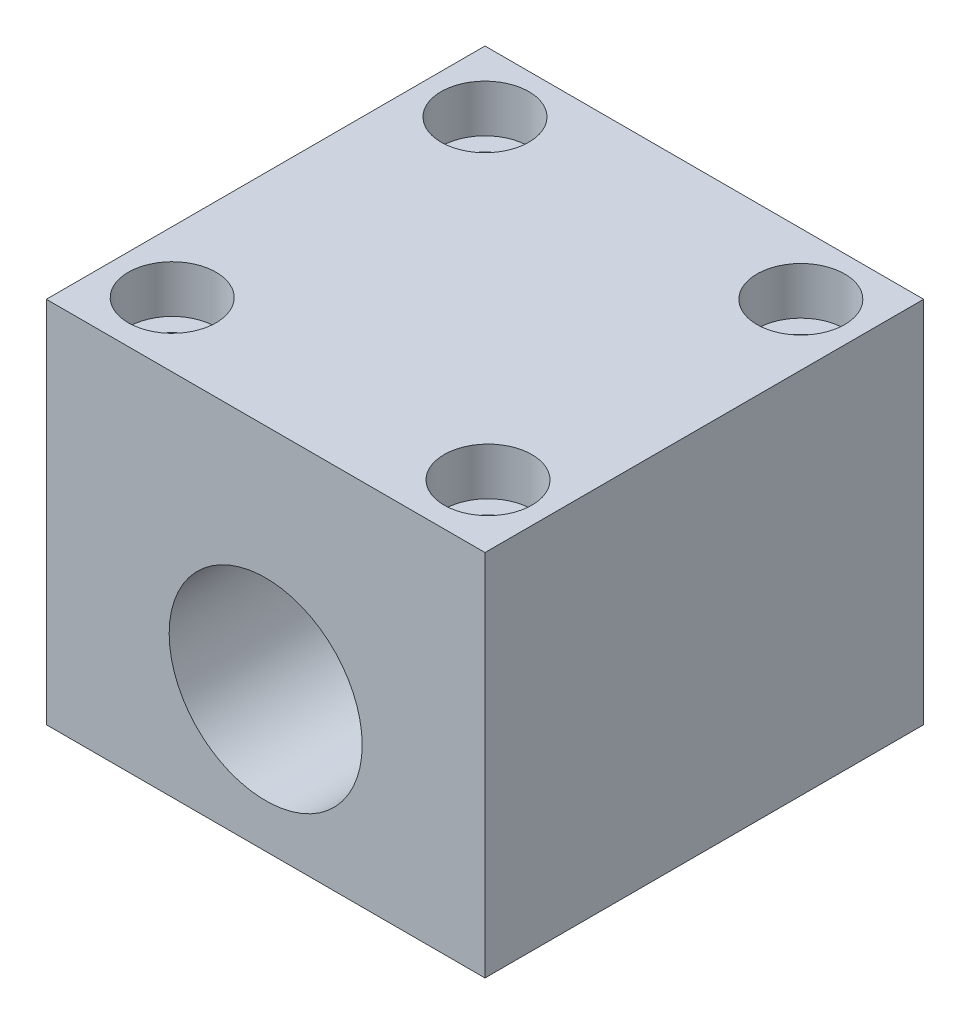
ISO-10303-21;
HEADER;
FILE_DESCRIPTION(('STEP AP214'),'2;1');
FILE_NAME('part.step','',(''),(''),'','','');
FILE_SCHEMA(('AUTOMOTIVE_DESIGN { 1 0 10303 214 1 1 1 1 }'));
ENDSEC;
DATA;
#1=APPLICATION_CONTEXT('core data for automotive mechanical design processes');
#2=APPLICATION_PROTOCOL_DEFINITION('international standard','automotive_design',2000,#1);
#3=PRODUCT_CONTEXT('',#1,'mechanical');
#4=PRODUCT('Part','Part','',(#3));
#5=PRODUCT_RELATED_PRODUCT_CATEGORY('part','',(#4));
#6=PRODUCT_DEFINITION_FORMATION('','',#4);
#7=PRODUCT_DEFINITION_CONTEXT('part definition',#1,'design');
#8=PRODUCT_DEFINITION('design','',#6,#7);
#9=PRODUCT_DEFINITION_SHAPE('','',#8);
#10=(LENGTH_UNIT() NAMED_UNIT(*) SI_UNIT(.MILLI.,.METRE.));
#11=(NAMED_UNIT(*) PLANE_ANGLE_UNIT() SI_UNIT($,.RADIAN.));
#12=(NAMED_UNIT(*) SI_UNIT($,.STERADIAN.) SOLID_ANGLE_UNIT());
#13=UNCERTAINTY_MEASURE_WITH_UNIT(LENGTH_MEASURE(1.E-05),#10,'distance_accuracy_value','');
#14=(GEOMETRIC_REPRESENTATION_CONTEXT(3) GLOBAL_UNCERTAINTY_ASSIGNED_CONTEXT((#13)) GLOBAL_UNIT_ASSIGNED_CONTEXT((#10,
#11,#12)) REPRESENTATION_CONTEXT('',''));
#15=CARTESIAN_POINT('',(0.,0.,0.));
#16=DIRECTION('',(0.,0.,1.));
#17=DIRECTION('',(1.,0.,0.));
#18=AXIS2_PLACEMENT_3D('',#15,#16,#17);
#19=CARTESIAN_POINT('',(-25.,-21.,-50.));
#20=DIRECTION('',(-1.,0.,0.));
#21=DIRECTION('',(0.,-1.,0.));
#22=AXIS2_PLACEMENT_3D('',#19,#20,#21);
#23=PLANE('',#22);
#24=DIRECTION('',(0.,-1.,0.));
#25=VECTOR('',#24,1.);
#26=CARTESIAN_POINT('',(-25.,-21.,0.));
#27=LINE('',#26,#25);
#28=CARTESIAN_POINT('',(-25.,21.,0.));
#29=VERTEX_POINT('',#28);
#30=CARTESIAN_POINT('',(-25.,-21.,0.));
#31=VERTEX_POINT('',#30);
#32=EDGE_CURVE('E103',#29,#31,#27,.T.);
#33=ORIENTED_EDGE('',*,*,#32,.F.);
#34=DIRECTION('',(0.,0.,1.));
#35=VECTOR('',#34,1.);
#36=CARTESIAN_POINT('',(-25.,21.,-50.));
#37=LINE('',#36,#35);
#38=CARTESIAN_POINT('',(-25.,21.,-50.));
#39=VERTEX_POINT('',#38);
#40=EDGE_CURVE('E11',#39,#29,#37,.T.);
#41=ORIENTED_EDGE('',*,*,#40,.F.);
#42=DIRECTION('',(0.,-1.,0.));
#43=VECTOR('',#42,1.);
#44=CARTESIAN_POINT('',(-25.,-21.,-50.));
#45=LINE('',#44,#43);
#46=CARTESIAN_POINT('',(-25.,-21.,-50.));
#47=VERTEX_POINT('',#46);
#48=EDGE_CURVE('E97',#39,#47,#45,.T.);
#49=ORIENTED_EDGE('',*,*,#48,.T.);
#50=DIRECTION('',(0.,0.,1.));
#51=VECTOR('',#50,1.);
#52=CARTESIAN_POINT('',(-25.,-21.,-50.));
#53=LINE('',#52,#51);
#54=EDGE_CURVE('E76',#47,#31,#53,.T.);
#55=ORIENTED_EDGE('',*,*,#54,.T.);
#56=EDGE_LOOP('',(#33,#41,#49,#55));
#57=FACE_BOUND('',#56,.T.);
#58=ADVANCED_FACE('F36',(#57),#23,.T.);
#59=CARTESIAN_POINT('',(-25.,21.,-50.));
#60=DIRECTION('',(0.,1.,0.));
#61=DIRECTION('',(0.,0.,1.));
#62=AXIS2_PLACEMENT_3D('',#59,#60,#61);
#63=PLANE('',#62);
#64=CARTESIAN_POINT('',(-18.,21.,-43.));
#65=DIRECTION('',(0.,1.,0.));
#66=DIRECTION('',(0.,0.,1.));
#67=AXIS2_PLACEMENT_3D('',#64,#65,#66);
#68=CIRCLE('',#67,5.);
#69=CARTESIAN_POINT('',(-18.,21.,-38.));
#70=VERTEX_POINT('',#69);
#71=EDGE_CURVE('E257',#70,#70,#68,.T.);
#72=ORIENTED_EDGE('',*,*,#71,.F.);
#73=EDGE_LOOP('',(#72));
#74=FACE_BOUND('',#73,.T.);
#75=CARTESIAN_POINT('',(-18.,21.,-7.34484149662151));
#76=DIRECTION('',(0.,1.,0.));
#77=DIRECTION('',(0.,0.,1.));
#78=AXIS2_PLACEMENT_3D('',#75,#76,#77);
#79=CIRCLE('',#78,5.);
#80=CARTESIAN_POINT('',(-18.,21.,-2.34484149662151));
#81=VERTEX_POINT('',#80);
#82=EDGE_CURVE('E265',#81,#81,#79,.T.);
#83=ORIENTED_EDGE('',*,*,#82,.F.);
#84=EDGE_LOOP('',(#83));
#85=FACE_BOUND('',#84,.T.);
#86=CARTESIAN_POINT('',(18.,21.,-7.34484149662151));
#87=DIRECTION('',(0.,1.,0.));
#88=DIRECTION('',(0.,0.,1.));
#89=AXIS2_PLACEMENT_3D('',#86,#87,#88);
#90=CIRCLE('',#89,5.);
#91=CARTESIAN_POINT('',(18.,21.,-2.34484149662151));
#92=VERTEX_POINT('',#91);
#93=EDGE_CURVE('E275',#92,#92,#90,.T.);
#94=ORIENTED_EDGE('',*,*,#93,.F.);
#95=EDGE_LOOP('',(#94));
#96=FACE_BOUND('',#95,.T.);
#97=CARTESIAN_POINT('',(18.,21.,-43.));
#98=DIRECTION('',(0.,1.,0.));
#99=DIRECTION('',(0.,0.,1.));
#100=AXIS2_PLACEMENT_3D('',#97,#98,#99);
#101=CIRCLE('',#100,5.);
#102=CARTESIAN_POINT('',(18.,21.,-38.));
#103=VERTEX_POINT('',#102);
#104=EDGE_CURVE('E285',#103,#103,#101,.T.);
#105=ORIENTED_EDGE('',*,*,#104,.F.);
#106=EDGE_LOOP('',(#105));
#107=FACE_BOUND('',#106,.T.);
#108=DIRECTION('',(-1.,0.,0.));
#109=VECTOR('',#108,1.);
#110=CARTESIAN_POINT('',(-25.,21.,0.));
#111=LINE('',#110,#109);
#112=CARTESIAN_POINT('',(25.,21.,0.));
#113=VERTEX_POINT('',#112);
#114=EDGE_CURVE('E67',#113,#29,#111,.T.);
#115=ORIENTED_EDGE('',*,*,#114,.F.);
#116=DIRECTION('',(0.,0.,1.));
#117=VECTOR('',#116,1.);
#118=CARTESIAN_POINT('',(25.,21.,-50.));
#119=LINE('',#118,#117);
#120=CARTESIAN_POINT('',(25.,21.,-50.));
#121=VERTEX_POINT('',#120);
#122=EDGE_CURVE('E45',#121,#113,#119,.T.);
#123=ORIENTED_EDGE('',*,*,#122,.F.);
#124=DIRECTION('',(-1.,0.,0.));
#125=VECTOR('',#124,1.);
#126=CARTESIAN_POINT('',(0.,21.,-50.));
#127=LINE('',#126,#125);
#128=EDGE_CURVE('E53',#121,#39,#127,.T.);
#129=ORIENTED_EDGE('',*,*,#128,.T.);
#130=ORIENTED_EDGE('',*,*,#40,.T.);
#131=EDGE_LOOP('',(#115,#123,#129,#130));
#132=FACE_BOUND('',#131,.T.);
#133=ADVANCED_FACE('F130',(#74,#85,#96,#107,#132),#63,.T.);
#134=CARTESIAN_POINT('',(25.,21.,-50.));
#135=DIRECTION('',(1.,0.,0.));
#136=DIRECTION('',(0.,1.,0.));
#137=AXIS2_PLACEMENT_3D('',#134,#135,#136);
#138=PLANE('',#137);
#139=DIRECTION('',(0.,1.,0.));
#140=VECTOR('',#139,1.);
#141=CARTESIAN_POINT('',(25.,21.,0.));
#142=LINE('',#141,#140);
#143=CARTESIAN_POINT('',(25.,-21.,0.));
#144=VERTEX_POINT('',#143);
#145=EDGE_CURVE('E87',#144,#113,#142,.T.);
#146=ORIENTED_EDGE('',*,*,#145,.F.);
#147=DIRECTION('',(0.,0.,1.));
#148=VECTOR('',#147,1.);
#149=CARTESIAN_POINT('',(25.,-21.,-50.));
#150=LINE('',#149,#148);
#151=CARTESIAN_POINT('',(25.,-21.,-50.));
#152=VERTEX_POINT('',#151);
#153=EDGE_CURVE('E82',#152,#144,#150,.T.);
#154=ORIENTED_EDGE('',*,*,#153,.F.);
#155=DIRECTION('',(0.,1.,0.));
#156=VECTOR('',#155,1.);
#157=CARTESIAN_POINT('',(25.,21.,-50.));
#158=LINE('',#157,#156);
#159=EDGE_CURVE('E85',#152,#121,#158,.T.);
#160=ORIENTED_EDGE('',*,*,#159,.T.);
#161=ORIENTED_EDGE('',*,*,#122,.T.);
#162=EDGE_LOOP('',(#146,#154,#160,#161));
#163=FACE_BOUND('',#162,.T.);
#164=ADVANCED_FACE('F84',(#163),#138,.T.);
#165=CARTESIAN_POINT('',(25.,-21.,-50.));
#166=DIRECTION('',(0.,-1.,0.));
#167=DIRECTION('',(1.,0.,0.));
#168=AXIS2_PLACEMENT_3D('',#165,#166,#167);
#169=PLANE('',#168);
#170=CARTESIAN_POINT('',(-18.,-21.,-43.));
#171=DIRECTION('',(0.,1.,0.));
#172=DIRECTION('',(0.,0.,1.));
#173=AXIS2_PLACEMENT_3D('',#170,#171,#172);
#174=CIRCLE('',#173,2.74999999999999);
#175=CARTESIAN_POINT('',(-18.,-21.,-40.25));
#176=VERTEX_POINT('',#175);
#177=EDGE_CURVE('E148',#176,#176,#174,.T.);
#178=ORIENTED_EDGE('',*,*,#177,.T.);
#179=EDGE_LOOP('',(#178));
#180=FACE_BOUND('',#179,.T.);
#181=CARTESIAN_POINT('',(-18.,-21.,-7.34484149662151));
#182=DIRECTION('',(0.,1.,0.));
#183=DIRECTION('',(0.,0.,1.));
#184=AXIS2_PLACEMENT_3D('',#181,#182,#183);
#185=CIRCLE('',#184,2.74999999999999);
#186=CARTESIAN_POINT('',(-18.,-21.,-4.59484149662152));
#187=VERTEX_POINT('',#186);
#188=EDGE_CURVE('E152',#187,#187,#185,.T.);
#189=ORIENTED_EDGE('',*,*,#188,.T.);
#190=EDGE_LOOP('',(#189));
#191=FACE_BOUND('',#190,.T.);
#192=CARTESIAN_POINT('',(18.,-21.,-7.34484149662151));
#193=DIRECTION('',(0.,1.,0.));
#194=DIRECTION('',(0.,0.,1.));
#195=AXIS2_PLACEMENT_3D('',#192,#193,#194);
#196=CIRCLE('',#195,2.74999999999999);
#197=CARTESIAN_POINT('',(18.,-21.,-4.59484149662152));
#198=VERTEX_POINT('',#197);
#199=EDGE_CURVE('E156',#198,#198,#196,.T.);
#200=ORIENTED_EDGE('',*,*,#199,.T.);
#201=EDGE_LOOP('',(#200));
#202=FACE_BOUND('',#201,.T.);
#203=CARTESIAN_POINT('',(18.,-21.,-43.));
#204=DIRECTION('',(0.,1.,0.));
#205=DIRECTION('',(0.,0.,1.));
#206=AXIS2_PLACEMENT_3D('',#203,#204,#205);
#207=CIRCLE('',#206,2.74999999999999);
#208=CARTESIAN_POINT('',(18.,-21.,-40.25));
#209=VERTEX_POINT('',#208);
#210=EDGE_CURVE('E159',#209,#209,#207,.T.);
#211=ORIENTED_EDGE('',*,*,#210,.T.);
#212=EDGE_LOOP('',(#211));
#213=FACE_BOUND('',#212,.T.);
#214=DIRECTION('',(1.,0.,0.));
#215=VECTOR('',#214,1.);
#216=CARTESIAN_POINT('',(25.,-21.,0.));
#217=LINE('',#216,#215);
#218=EDGE_CURVE('E106',#31,#144,#217,.T.);
#219=ORIENTED_EDGE('',*,*,#218,.F.);
#220=ORIENTED_EDGE('',*,*,#54,.F.);
#221=DIRECTION('',(1.,0.,0.));
#222=VECTOR('',#221,1.);
#223=CARTESIAN_POINT('',(25.,-21.,-50.));
#224=LINE('',#223,#222);
#225=EDGE_CURVE('E93',#47,#152,#224,.T.);
#226=ORIENTED_EDGE('',*,*,#225,.T.);
#227=ORIENTED_EDGE('',*,*,#153,.T.);
#228=EDGE_LOOP('',(#219,#220,#226,#227));
#229=FACE_BOUND('',#228,.T.);
#230=ADVANCED_FACE('F96',(#180,#191,#202,#213,#229),#169,.T.);
#231=CARTESIAN_POINT('',(0.,0.,-50.));
#232=DIRECTION('',(0.,0.,-1.));
#233=DIRECTION('',(-1.,0.,0.));
#234=AXIS2_PLACEMENT_3D('',#231,#232,#233);
#235=PLANE('',#234);
#236=CARTESIAN_POINT('',(0.,-5.,-50.));
#237=DIRECTION('',(0.,0.,-1.));
#238=DIRECTION('',(-1.,0.,0.));
#239=AXIS2_PLACEMENT_3D('',#236,#237,#238);
#240=CIRCLE('',#239,11.);
#241=CARTESIAN_POINT('',(-11.,-5.,-50.));
#242=VERTEX_POINT('',#241);
#243=EDGE_CURVE('E176',#242,#242,#240,.T.);
#244=ORIENTED_EDGE('',*,*,#243,.F.);
#245=EDGE_LOOP('',(#244));
#246=FACE_BOUND('',#245,.T.);
#247=ORIENTED_EDGE('',*,*,#48,.F.);
#248=ORIENTED_EDGE('',*,*,#128,.F.);
#249=ORIENTED_EDGE('',*,*,#159,.F.);
#250=ORIENTED_EDGE('',*,*,#225,.F.);
#251=EDGE_LOOP('',(#247,#248,#249,#250));
#252=FACE_BOUND('',#251,.T.);
#253=ADVANCED_FACE('F92',(#246,#252),#235,.T.);
#254=CARTESIAN_POINT('',(0.,0.,0.));
#255=DIRECTION('',(0.,0.,-1.));
#256=DIRECTION('',(-1.,0.,0.));
#257=AXIS2_PLACEMENT_3D('',#254,#255,#256);
#258=PLANE('',#257);
#259=CARTESIAN_POINT('',(0.,-5.,0.));
#260=DIRECTION('',(0.,0.,1.));
#261=DIRECTION('',(1.,0.,0.));
#262=AXIS2_PLACEMENT_3D('',#259,#260,#261);
#263=CIRCLE('',#262,11.);
#264=CARTESIAN_POINT('',(11.,-5.,0.));
#265=VERTEX_POINT('',#264);
#266=EDGE_CURVE('E172',#265,#265,#263,.T.);
#267=ORIENTED_EDGE('',*,*,#266,.F.);
#268=EDGE_LOOP('',(#267));
#269=FACE_BOUND('',#268,.T.);
#270=ORIENTED_EDGE('',*,*,#32,.T.);
#271=ORIENTED_EDGE('',*,*,#218,.T.);
#272=ORIENTED_EDGE('',*,*,#145,.T.);
#273=ORIENTED_EDGE('',*,*,#114,.T.);
#274=EDGE_LOOP('',(#270,#271,#272,#273));
#275=FACE_BOUND('',#274,.T.);
#276=ADVANCED_FACE('F113',(#269,#275),#258,.F.);
#277=CARTESIAN_POINT('',(0.,-5.,-36.));
#278=DIRECTION('',(0.,0.,-1.));
#279=DIRECTION('',(-1.,0.,0.));
#280=AXIS2_PLACEMENT_3D('',#277,#278,#279);
#281=CYLINDRICAL_SURFACE('',#280,11.);
#282=CARTESIAN_POINT('',(0.,-5.,-36.));
#283=DIRECTION('',(0.,0.,-1.));
#284=DIRECTION('',(-1.,0.,0.));
#285=AXIS2_PLACEMENT_3D('',#282,#283,#284);
#286=CIRCLE('',#285,11.);
#287=CARTESIAN_POINT('',(-11.,-5.,-36.));
#288=VERTEX_POINT('',#287);
#289=EDGE_CURVE('E107',#288,#288,#286,.T.);
#290=ORIENTED_EDGE('',*,*,#289,.F.);
#291=EDGE_LOOP('',(#290));
#292=FACE_BOUND('',#291,.T.);
#293=ORIENTED_EDGE('',*,*,#243,.T.);
#294=EDGE_LOOP('',(#293));
#295=FACE_BOUND('',#294,.T.);
#296=ADVANCED_FACE('F115',(#292,#295),#281,.F.);
#297=CARTESIAN_POINT('',(0.,-5.,-36.));
#298=DIRECTION('',(0.,0.,-1.));
#299=DIRECTION('',(-1.,0.,0.));
#300=AXIS2_PLACEMENT_3D('',#297,#298,#299);
#301=PLANE('',#300);
#302=CARTESIAN_POINT('',(0.,-5.,-36.));
#303=DIRECTION('',(0.,0.,-1.));
#304=DIRECTION('',(-1.,0.,0.));
#305=AXIS2_PLACEMENT_3D('',#302,#303,#304);
#306=CIRCLE('',#305,6.5);
#307=CARTESIAN_POINT('',(-6.5,-5.,-36.));
#308=VERTEX_POINT('',#307);
#309=EDGE_CURVE('E164',#308,#308,#306,.T.);
#310=ORIENTED_EDGE('',*,*,#309,.F.);
#311=EDGE_LOOP('',(#310));
#312=FACE_BOUND('',#311,.T.);
#313=ORIENTED_EDGE('',*,*,#289,.T.);
#314=EDGE_LOOP('',(#313));
#315=FACE_BOUND('',#314,.T.);
#316=ADVANCED_FACE('F122',(#312,#315),#301,.T.);
#317=CARTESIAN_POINT('',(0.,-5.,-30.));
#318=DIRECTION('',(0.,0.,1.));
#319=DIRECTION('',(1.,0.,0.));
#320=AXIS2_PLACEMENT_3D('',#317,#318,#319);
#321=CYLINDRICAL_SURFACE('',#320,11.);
#322=CARTESIAN_POINT('',(0.,-5.,-30.));
#323=DIRECTION('',(0.,0.,1.));
#324=DIRECTION('',(1.,0.,0.));
#325=AXIS2_PLACEMENT_3D('',#322,#323,#324);
#326=CIRCLE('',#325,11.);
#327=CARTESIAN_POINT('',(11.,-5.,-30.));
#328=VERTEX_POINT('',#327);
#329=EDGE_CURVE('E173',#328,#328,#326,.T.);
#330=ORIENTED_EDGE('',*,*,#329,.F.);
#331=EDGE_LOOP('',(#330));
#332=FACE_BOUND('',#331,.T.);
#333=ORIENTED_EDGE('',*,*,#266,.T.);
#334=EDGE_LOOP('',(#333));
#335=FACE_BOUND('',#334,.T.);
#336=ADVANCED_FACE('F186',(#332,#335),#321,.F.);
#337=CARTESIAN_POINT('',(0.,-5.,-30.));
#338=DIRECTION('',(0.,0.,1.));
#339=DIRECTION('',(1.,0.,0.));
#340=AXIS2_PLACEMENT_3D('',#337,#338,#339);
#341=PLANE('',#340);
#342=CARTESIAN_POINT('',(0.,-5.,-30.));
#343=DIRECTION('',(0.,0.,1.));
#344=DIRECTION('',(1.,0.,0.));
#345=AXIS2_PLACEMENT_3D('',#342,#343,#344);
#346=CIRCLE('',#345,6.5);
#347=CARTESIAN_POINT('',(6.5,-5.,-30.));
#348=VERTEX_POINT('',#347);
#349=EDGE_CURVE('E39',#348,#348,#346,.T.);
#350=ORIENTED_EDGE('',*,*,#349,.F.);
#351=EDGE_LOOP('',(#350));
#352=FACE_BOUND('',#351,.T.);
#353=ORIENTED_EDGE('',*,*,#329,.T.);
#354=EDGE_LOOP('',(#353));
#355=FACE_BOUND('',#354,.T.);
#356=ADVANCED_FACE('F192',(#352,#355),#341,.T.);
#357=CARTESIAN_POINT('',(0.,-5.,-50.));
#358=DIRECTION('',(0.,0.,1.));
#359=DIRECTION('',(1.,0.,0.));
#360=AXIS2_PLACEMENT_3D('',#357,#358,#359);
#361=CYLINDRICAL_SURFACE('',#360,6.5);
#362=ORIENTED_EDGE('',*,*,#309,.T.);
#363=EDGE_LOOP('',(#362));
#364=FACE_BOUND('',#363,.T.);
#365=ORIENTED_EDGE('',*,*,#349,.T.);
#366=EDGE_LOOP('',(#365));
#367=FACE_BOUND('',#366,.T.);
#368=ADVANCED_FACE('F199',(#364,#367),#361,.F.);
#369=CARTESIAN_POINT('',(18.,21.,-43.));
#370=DIRECTION('',(0.,1.,0.));
#371=DIRECTION('',(0.,0.,1.));
#372=AXIS2_PLACEMENT_3D('',#369,#370,#371);
#373=CYLINDRICAL_SURFACE('',#372,2.75);
#374=ORIENTED_EDGE('',*,*,#210,.F.);
#375=EDGE_LOOP('',(#374));
#376=FACE_BOUND('',#375,.T.);
#377=CARTESIAN_POINT('',(18.,15.6,-43.));
#378=DIRECTION('',(0.,1.,0.));
#379=DIRECTION('',(0.,0.,1.));
#380=AXIS2_PLACEMENT_3D('',#377,#378,#379);
#381=CIRCLE('',#380,2.75);
#382=CARTESIAN_POINT('',(18.,15.6,-40.25));
#383=VERTEX_POINT('',#382);
#384=EDGE_CURVE('E161',#383,#383,#381,.T.);
#385=ORIENTED_EDGE('',*,*,#384,.T.);
#386=EDGE_LOOP('',(#385));
#387=FACE_BOUND('',#386,.T.);
#388=ADVANCED_FACE('F203',(#376,#387),#373,.F.);
#389=CARTESIAN_POINT('',(20.75,15.6,-43.));
#390=DIRECTION('',(0.,-1.,0.));
#391=DIRECTION('',(0.,0.,-1.));
#392=AXIS2_PLACEMENT_3D('',#389,#390,#391);
#393=PLANE('',#392);
#394=ORIENTED_EDGE('',*,*,#384,.F.);
#395=EDGE_LOOP('',(#394));
#396=FACE_BOUND('',#395,.T.);
#397=CARTESIAN_POINT('',(18.,15.6,-43.));
#398=DIRECTION('',(0.,1.,0.));
#399=DIRECTION('',(0.,0.,1.));
#400=AXIS2_PLACEMENT_3D('',#397,#398,#399);
#401=CIRCLE('',#400,5.);
#402=CARTESIAN_POINT('',(18.,15.6,-38.));
#403=VERTEX_POINT('',#402);
#404=EDGE_CURVE('E166',#403,#403,#401,.T.);
#405=ORIENTED_EDGE('',*,*,#404,.T.);
#406=EDGE_LOOP('',(#405));
#407=FACE_BOUND('',#406,.T.);
#408=ADVANCED_FACE('F207',(#396,#407),#393,.F.);
#409=CARTESIAN_POINT('',(18.,21.,-43.));
#410=DIRECTION('',(0.,1.,0.));
#411=DIRECTION('',(0.,0.,1.));
#412=AXIS2_PLACEMENT_3D('',#409,#410,#411);
#413=CYLINDRICAL_SURFACE('',#412,5.);
#414=ORIENTED_EDGE('',*,*,#404,.F.);
#415=EDGE_LOOP('',(#414));
#416=FACE_BOUND('',#415,.T.);
#417=ORIENTED_EDGE('',*,*,#104,.T.);
#418=EDGE_LOOP('',(#417));
#419=FACE_BOUND('',#418,.T.);
#420=ADVANCED_FACE('F210',(#416,#419),#413,.F.);
#421=CARTESIAN_POINT('',(18.,21.,-7.34484149662151));
#422=DIRECTION('',(0.,1.,0.));
#423=DIRECTION('',(0.,0.,1.));
#424=AXIS2_PLACEMENT_3D('',#421,#422,#423);
#425=CYLINDRICAL_SURFACE('',#424,2.75);
#426=ORIENTED_EDGE('',*,*,#199,.F.);
#427=EDGE_LOOP('',(#426));
#428=FACE_BOUND('',#427,.T.);
#429=CARTESIAN_POINT('',(18.,15.6,-7.34484149662151));
#430=DIRECTION('',(0.,1.,0.));
#431=DIRECTION('',(0.,0.,1.));
#432=AXIS2_PLACEMENT_3D('',#429,#430,#431);
#433=CIRCLE('',#432,2.75);
#434=CARTESIAN_POINT('',(18.,15.6,-4.59484149662151));
#435=VERTEX_POINT('',#434);
#436=EDGE_CURVE('E281',#435,#435,#433,.T.);
#437=ORIENTED_EDGE('',*,*,#436,.T.);
#438=EDGE_LOOP('',(#437));
#439=FACE_BOUND('',#438,.T.);
#440=ADVANCED_FACE('F214',(#428,#439),#425,.F.);
#441=CARTESIAN_POINT('',(20.75,15.6,-7.34484149662151));
#442=DIRECTION('',(0.,-1.,0.));
#443=DIRECTION('',(0.,0.,-1.));
#444=AXIS2_PLACEMENT_3D('',#441,#442,#443);
#445=PLANE('',#444);
#446=ORIENTED_EDGE('',*,*,#436,.F.);
#447=EDGE_LOOP('',(#446));
#448=FACE_BOUND('',#447,.T.);
#449=CARTESIAN_POINT('',(18.,15.6,-7.34484149662151));
#450=DIRECTION('',(0.,1.,0.));
#451=DIRECTION('',(0.,0.,1.));
#452=AXIS2_PLACEMENT_3D('',#449,#450,#451);
#453=CIRCLE('',#452,5.);
#454=CARTESIAN_POINT('',(18.,15.6,-2.34484149662152));
#455=VERTEX_POINT('',#454);
#456=EDGE_CURVE('E278',#455,#455,#453,.T.);
#457=ORIENTED_EDGE('',*,*,#456,.T.);
#458=EDGE_LOOP('',(#457));
#459=FACE_BOUND('',#458,.T.);
#460=ADVANCED_FACE('F218',(#448,#459),#445,.F.);
#461=CARTESIAN_POINT('',(18.,21.,-7.34484149662151));
#462=DIRECTION('',(0.,1.,0.));
#463=DIRECTION('',(0.,0.,1.));
#464=AXIS2_PLACEMENT_3D('',#461,#462,#463);
#465=CYLINDRICAL_SURFACE('',#464,5.);
#466=ORIENTED_EDGE('',*,*,#456,.F.);
#467=EDGE_LOOP('',(#466));
#468=FACE_BOUND('',#467,.T.);
#469=ORIENTED_EDGE('',*,*,#93,.T.);
#470=EDGE_LOOP('',(#469));
#471=FACE_BOUND('',#470,.T.);
#472=ADVANCED_FACE('F222',(#468,#471),#465,.F.);
#473=CARTESIAN_POINT('',(-18.,21.,-7.34484149662151));
#474=DIRECTION('',(0.,1.,0.));
#475=DIRECTION('',(0.,0.,1.));
#476=AXIS2_PLACEMENT_3D('',#473,#474,#475);
#477=CYLINDRICAL_SURFACE('',#476,2.75);
#478=ORIENTED_EDGE('',*,*,#188,.F.);
#479=EDGE_LOOP('',(#478));
#480=FACE_BOUND('',#479,.T.);
#481=CARTESIAN_POINT('',(-18.,15.6,-7.34484149662151));
#482=DIRECTION('',(0.,1.,0.));
#483=DIRECTION('',(0.,0.,1.));
#484=AXIS2_PLACEMENT_3D('',#481,#482,#483);
#485=CIRCLE('',#484,2.75);
#486=CARTESIAN_POINT('',(-18.,15.6,-4.59484149662151));
#487=VERTEX_POINT('',#486);
#488=EDGE_CURVE('E271',#487,#487,#485,.T.);
#489=ORIENTED_EDGE('',*,*,#488,.T.);
#490=EDGE_LOOP('',(#489));
#491=FACE_BOUND('',#490,.T.);
#492=ADVANCED_FACE('F226',(#480,#491),#477,.F.);
#493=CARTESIAN_POINT('',(-15.25,15.6,-7.34484149662151));
#494=DIRECTION('',(0.,-1.,0.));
#495=DIRECTION('',(0.,0.,-1.));
#496=AXIS2_PLACEMENT_3D('',#493,#494,#495);
#497=PLANE('',#496);
#498=ORIENTED_EDGE('',*,*,#488,.F.);
#499=EDGE_LOOP('',(#498));
#500=FACE_BOUND('',#499,.T.);
#501=CARTESIAN_POINT('',(-18.,15.6,-7.34484149662151));
#502=DIRECTION('',(0.,1.,0.));
#503=DIRECTION('',(0.,0.,1.));
#504=AXIS2_PLACEMENT_3D('',#501,#502,#503);
#505=CIRCLE('',#504,5.);
#506=CARTESIAN_POINT('',(-18.,15.6,-2.34484149662151));
#507=VERTEX_POINT('',#506);
#508=EDGE_CURVE('E268',#507,#507,#505,.T.);
#509=ORIENTED_EDGE('',*,*,#508,.T.);
#510=EDGE_LOOP('',(#509));
#511=FACE_BOUND('',#510,.T.);
#512=ADVANCED_FACE('F230',(#500,#511),#497,.F.);
#513=CARTESIAN_POINT('',(-18.,21.,-7.34484149662151));
#514=DIRECTION('',(0.,1.,0.));
#515=DIRECTION('',(0.,0.,1.));
#516=AXIS2_PLACEMENT_3D('',#513,#514,#515);
#517=CYLINDRICAL_SURFACE('',#516,5.);
#518=ORIENTED_EDGE('',*,*,#508,.F.);
#519=EDGE_LOOP('',(#518));
#520=FACE_BOUND('',#519,.T.);
#521=ORIENTED_EDGE('',*,*,#82,.T.);
#522=EDGE_LOOP('',(#521));
#523=FACE_BOUND('',#522,.T.);
#524=ADVANCED_FACE('F234',(#520,#523),#517,.F.);
#525=CARTESIAN_POINT('',(-18.,21.,-43.));
#526=DIRECTION('',(0.,1.,0.));
#527=DIRECTION('',(0.,0.,1.));
#528=AXIS2_PLACEMENT_3D('',#525,#526,#527);
#529=CYLINDRICAL_SURFACE('',#528,2.75);
#530=ORIENTED_EDGE('',*,*,#177,.F.);
#531=EDGE_LOOP('',(#530));
#532=FACE_BOUND('',#531,.T.);
#533=CARTESIAN_POINT('',(-18.,15.6,-43.));
#534=DIRECTION('',(0.,1.,0.));
#535=DIRECTION('',(0.,0.,1.));
#536=AXIS2_PLACEMENT_3D('',#533,#534,#535);
#537=CIRCLE('',#536,2.75);
#538=CARTESIAN_POINT('',(-18.,15.6,-40.25));
#539=VERTEX_POINT('',#538);
#540=EDGE_CURVE('E259',#539,#539,#537,.T.);
#541=ORIENTED_EDGE('',*,*,#540,.T.);
#542=EDGE_LOOP('',(#541));
#543=FACE_BOUND('',#542,.T.);
#544=ADVANCED_FACE('F238',(#532,#543),#529,.F.);
#545=CARTESIAN_POINT('',(-15.25,15.6,-43.));
#546=DIRECTION('',(0.,-1.,0.));
#547=DIRECTION('',(0.,0.,-1.));
#548=AXIS2_PLACEMENT_3D('',#545,#546,#547);
#549=PLANE('',#548);
#550=ORIENTED_EDGE('',*,*,#540,.F.);
#551=EDGE_LOOP('',(#550));
#552=FACE_BOUND('',#551,.T.);
#553=CARTESIAN_POINT('',(-18.,15.6,-43.));
#554=DIRECTION('',(0.,1.,0.));
#555=DIRECTION('',(0.,0.,1.));
#556=AXIS2_PLACEMENT_3D('',#553,#554,#555);
#557=CIRCLE('',#556,5.);
#558=CARTESIAN_POINT('',(-18.,15.6,-38.));
#559=VERTEX_POINT('',#558);
#560=EDGE_CURVE('E255',#559,#559,#557,.T.);
#561=ORIENTED_EDGE('',*,*,#560,.T.);
#562=EDGE_LOOP('',(#561));
#563=FACE_BOUND('',#562,.T.);
#564=ADVANCED_FACE('F242',(#552,#563),#549,.F.);
#565=CARTESIAN_POINT('',(-18.,21.,-43.));
#566=DIRECTION('',(0.,1.,0.));
#567=DIRECTION('',(0.,0.,1.));
#568=AXIS2_PLACEMENT_3D('',#565,#566,#567);
#569=CYLINDRICAL_SURFACE('',#568,5.);
#570=ORIENTED_EDGE('',*,*,#560,.F.);
#571=EDGE_LOOP('',(#570));
#572=FACE_BOUND('',#571,.T.);
#573=ORIENTED_EDGE('',*,*,#71,.T.);
#574=EDGE_LOOP('',(#573));
#575=FACE_BOUND('',#574,.T.);
#576=ADVANCED_FACE('F246',(#572,#575),#569,.F.);
#577=CLOSED_SHELL('',(#58,#133,#164,#230,#253,#276,#296,#316,#336,#356,#368,#388,#408,#420,#440,
#460,#472,#492,#512,#524,#544,#564,#576));
#578=MANIFOLD_SOLID_BREP('B2',#577);
#579=ADVANCED_BREP_SHAPE_REPRESENTATION('',(#18,#578),#14);
#580=SHAPE_DEFINITION_REPRESENTATION(#9,#579);
ENDSEC;
END-ISO-10303-21;
